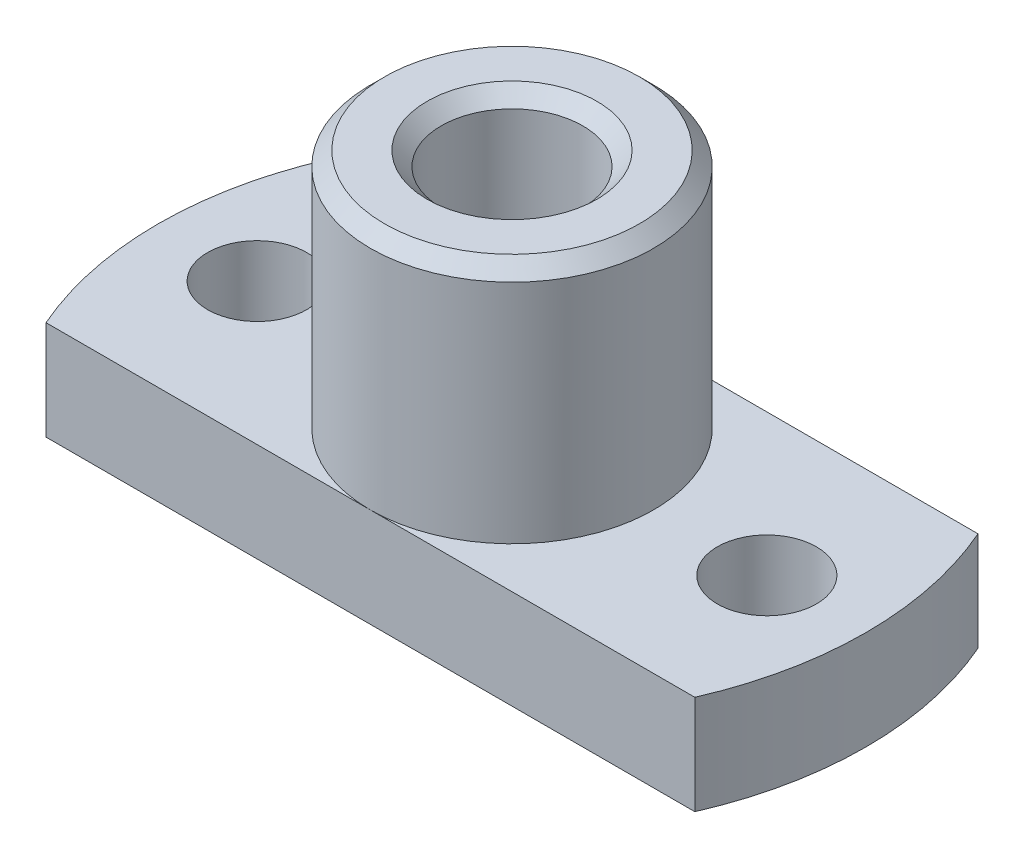
ISO-10303-21;
HEADER;
FILE_DESCRIPTION(('STEP AP214'),'2;1');
FILE_NAME('part.step','',(''),(''),'','','');
FILE_SCHEMA(('AUTOMOTIVE_DESIGN { 1 0 10303 214 1 1 1 1 }'));
ENDSEC;
DATA;
#1=APPLICATION_CONTEXT('core data for automotive mechanical design processes');
#2=APPLICATION_PROTOCOL_DEFINITION('international standard','automotive_design',2000,#1);
#3=PRODUCT_CONTEXT('',#1,'mechanical');
#4=PRODUCT('Part','Part','',(#3));
#5=PRODUCT_RELATED_PRODUCT_CATEGORY('part','',(#4));
#6=PRODUCT_DEFINITION_FORMATION('','',#4);
#7=PRODUCT_DEFINITION_CONTEXT('part definition',#1,'design');
#8=PRODUCT_DEFINITION('design','',#6,#7);
#9=PRODUCT_DEFINITION_SHAPE('','',#8);
#10=(LENGTH_UNIT() NAMED_UNIT(*) SI_UNIT(.MILLI.,.METRE.));
#11=(NAMED_UNIT(*) PLANE_ANGLE_UNIT() SI_UNIT($,.RADIAN.));
#12=(NAMED_UNIT(*) SI_UNIT($,.STERADIAN.) SOLID_ANGLE_UNIT());
#13=UNCERTAINTY_MEASURE_WITH_UNIT(LENGTH_MEASURE(1.E-05),#10,'distance_accuracy_value','');
#14=(GEOMETRIC_REPRESENTATION_CONTEXT(3) GLOBAL_UNCERTAINTY_ASSIGNED_CONTEXT((#13)) GLOBAL_UNIT_ASSIGNED_CONTEXT((#10,
#11,#12)) REPRESENTATION_CONTEXT('',''));
#15=CARTESIAN_POINT('',(0.,0.,0.));
#16=DIRECTION('',(0.,0.,1.));
#17=DIRECTION('',(1.,0.,0.));
#18=AXIS2_PLACEMENT_3D('',#15,#16,#17);
#19=CARTESIAN_POINT('',(0.,3.5,0.));
#20=DIRECTION('',(0.,1.,0.));
#21=DIRECTION('',(0.,0.,1.));
#22=AXIS2_PLACEMENT_3D('',#19,#20,#21);
#23=PLANE('',#22);
#24=CARTESIAN_POINT('',(9.,3.5,0.));
#25=DIRECTION('',(0.,1.,0.));
#26=DIRECTION('',(0.,0.,-1.));
#27=AXIS2_PLACEMENT_3D('',#24,#25,#26);
#28=CIRCLE('',#27,1.75);
#29=CARTESIAN_POINT('',(9.,3.5,-1.75));
#30=VERTEX_POINT('',#29);
#31=EDGE_CURVE('E203',#30,#30,#28,.T.);
#32=ORIENTED_EDGE('',*,*,#31,.F.);
#33=EDGE_LOOP('',(#32));
#34=FACE_BOUND('',#33,.T.);
#35=CARTESIAN_POINT('',(0.,3.5,0.));
#36=DIRECTION('',(0.,1.,0.));
#37=DIRECTION('',(0.,0.,1.));
#38=AXIS2_PLACEMENT_3D('',#35,#36,#37);
#39=CIRCLE('',#38,5.);
#40=CARTESIAN_POINT('',(0.,3.5,5.));
#41=VERTEX_POINT('',#40);
#42=CARTESIAN_POINT('',(0.,3.5,-5.));
#43=VERTEX_POINT('',#42);
#44=EDGE_CURVE('E120',#41,#43,#39,.T.);
#45=ORIENTED_EDGE('',*,*,#44,.F.);
#46=DIRECTION('',(1.,0.,0.));
#47=VECTOR('',#46,1.);
#48=CARTESIAN_POINT('',(0.,3.5,5.));
#49=LINE('',#48,#47);
#50=CARTESIAN_POINT('',(11.4564392373896,3.5,5.));
#51=VERTEX_POINT('',#50);
#52=EDGE_CURVE('E108',#41,#51,#49,.T.);
#53=ORIENTED_EDGE('',*,*,#52,.T.);
#54=CARTESIAN_POINT('',(0.,3.5,0.));
#55=DIRECTION('',(0.,1.,0.));
#56=DIRECTION('',(0.,0.,1.));
#57=AXIS2_PLACEMENT_3D('',#54,#55,#56);
#58=CIRCLE('',#57,12.5);
#59=CARTESIAN_POINT('',(11.4564392373896,3.5,-5.));
#60=VERTEX_POINT('',#59);
#61=EDGE_CURVE('E107',#51,#60,#58,.T.);
#62=ORIENTED_EDGE('',*,*,#61,.T.);
#63=DIRECTION('',(1.,0.,0.));
#64=VECTOR('',#63,1.);
#65=CARTESIAN_POINT('',(0.,3.5,-5.));
#66=LINE('',#65,#64);
#67=EDGE_CURVE('E121',#43,#60,#66,.T.);
#68=ORIENTED_EDGE('',*,*,#67,.F.);
#69=EDGE_LOOP('',(#45,#53,#62,#68));
#70=FACE_BOUND('',#69,.T.);
#71=ADVANCED_FACE('F47',(#34,#70),#23,.T.);
#72=CARTESIAN_POINT('',(0.,3.5,0.));
#73=DIRECTION('',(0.,-1.,0.));
#74=DIRECTION('',(0.,0.,-1.));
#75=AXIS2_PLACEMENT_3D('',#72,#73,#74);
#76=CYLINDRICAL_SURFACE('',#75,12.5);
#77=CARTESIAN_POINT('',(0.,0.,0.));
#78=DIRECTION('',(0.,1.,0.));
#79=DIRECTION('',(0.,0.,1.));
#80=AXIS2_PLACEMENT_3D('',#77,#78,#79);
#81=CIRCLE('',#80,12.5);
#82=CARTESIAN_POINT('',(-11.4564392373896,0.,-5.));
#83=VERTEX_POINT('',#82);
#84=CARTESIAN_POINT('',(-11.4564392373896,0.,5.));
#85=VERTEX_POINT('',#84);
#86=EDGE_CURVE('E124',#83,#85,#81,.T.);
#87=ORIENTED_EDGE('',*,*,#86,.T.);
#88=DIRECTION('',(0.,-1.,0.));
#89=VECTOR('',#88,1.);
#90=CARTESIAN_POINT('',(-11.4564392373896,3.5,5.));
#91=LINE('',#90,#89);
#92=CARTESIAN_POINT('',(-11.4564392373896,3.5,5.));
#93=VERTEX_POINT('',#92);
#94=EDGE_CURVE('E130',#93,#85,#91,.T.);
#95=ORIENTED_EDGE('',*,*,#94,.F.);
#96=CARTESIAN_POINT('',(-11.4564392373896,3.5,-5.));
#97=VERTEX_POINT('',#96);
#98=EDGE_CURVE('E104',#97,#93,#58,.T.);
#99=ORIENTED_EDGE('',*,*,#98,.F.);
#100=DIRECTION('',(0.,-1.,0.));
#101=VECTOR('',#100,1.);
#102=CARTESIAN_POINT('',(-11.4564392373896,3.5,-5.));
#103=LINE('',#102,#101);
#104=EDGE_CURVE('E73',#97,#83,#103,.T.);
#105=ORIENTED_EDGE('',*,*,#104,.T.);
#106=EDGE_LOOP('',(#87,#95,#99,#105));
#107=FACE_BOUND('',#106,.T.);
#108=ADVANCED_FACE('F221',(#107),#76,.T.);
#109=CARTESIAN_POINT('',(0.,3.5,5.));
#110=DIRECTION('',(0.,0.,-1.));
#111=DIRECTION('',(-1.,0.,0.));
#112=AXIS2_PLACEMENT_3D('',#109,#110,#111);
#113=PLANE('',#112);
#114=DIRECTION('',(1.,0.,0.));
#115=VECTOR('',#114,1.);
#116=CARTESIAN_POINT('',(0.,0.,5.));
#117=LINE('',#116,#115);
#118=CARTESIAN_POINT('',(11.4564392373896,0.,5.));
#119=VERTEX_POINT('',#118);
#120=EDGE_CURVE('E148',#85,#119,#117,.T.);
#121=ORIENTED_EDGE('',*,*,#120,.T.);
#122=DIRECTION('',(0.,-1.,0.));
#123=VECTOR('',#122,1.);
#124=CARTESIAN_POINT('',(11.4564392373896,3.5,5.));
#125=LINE('',#124,#123);
#126=EDGE_CURVE('E114',#51,#119,#125,.T.);
#127=ORIENTED_EDGE('',*,*,#126,.F.);
#128=ORIENTED_EDGE('',*,*,#52,.F.);
#129=EDGE_CURVE('E99',#93,#41,#49,.T.);
#130=ORIENTED_EDGE('',*,*,#129,.F.);
#131=ORIENTED_EDGE('',*,*,#94,.T.);
#132=EDGE_LOOP('',(#121,#127,#128,#130,#131));
#133=FACE_BOUND('',#132,.T.);
#134=ADVANCED_FACE('F112',(#133),#113,.F.);
#135=CARTESIAN_POINT('',(11.4564392373896,0.,-5.));
#136=VERTEX_POINT('',#135);
#137=EDGE_CURVE('E149',#119,#136,#81,.T.);
#138=ORIENTED_EDGE('',*,*,#137,.T.);
#139=DIRECTION('',(0.,-1.,0.));
#140=VECTOR('',#139,1.);
#141=CARTESIAN_POINT('',(11.4564392373896,3.5,-5.));
#142=LINE('',#141,#140);
#143=EDGE_CURVE('E157',#60,#136,#142,.T.);
#144=ORIENTED_EDGE('',*,*,#143,.F.);
#145=ORIENTED_EDGE('',*,*,#61,.F.);
#146=ORIENTED_EDGE('',*,*,#126,.T.);
#147=EDGE_LOOP('',(#138,#144,#145,#146));
#148=FACE_BOUND('',#147,.T.);
#149=ADVANCED_FACE('F227',(#148),#76,.T.);
#150=CARTESIAN_POINT('',(0.,3.5,-5.));
#151=DIRECTION('',(0.,0.,-1.));
#152=DIRECTION('',(-1.,0.,0.));
#153=AXIS2_PLACEMENT_3D('',#150,#151,#152);
#154=PLANE('',#153);
#155=DIRECTION('',(1.,0.,0.));
#156=VECTOR('',#155,1.);
#157=CARTESIAN_POINT('',(0.,0.,-5.));
#158=LINE('',#157,#156);
#159=EDGE_CURVE('E141',#83,#136,#158,.T.);
#160=ORIENTED_EDGE('',*,*,#159,.F.);
#161=ORIENTED_EDGE('',*,*,#104,.F.);
#162=EDGE_CURVE('E143',#97,#43,#66,.T.);
#163=ORIENTED_EDGE('',*,*,#162,.T.);
#164=ORIENTED_EDGE('',*,*,#67,.T.);
#165=ORIENTED_EDGE('',*,*,#143,.T.);
#166=EDGE_LOOP('',(#160,#161,#163,#164,#165));
#167=FACE_BOUND('',#166,.T.);
#168=ADVANCED_FACE('F231',(#167),#154,.T.);
#169=CARTESIAN_POINT('',(-9.,3.5,0.));
#170=DIRECTION('',(0.,1.,0.));
#171=DIRECTION('',(0.,0.,1.));
#172=AXIS2_PLACEMENT_3D('',#169,#170,#171);
#173=CIRCLE('',#172,1.75);
#174=CARTESIAN_POINT('',(-9.,3.5,1.75));
#175=VERTEX_POINT('',#174);
#176=EDGE_CURVE('E197',#175,#175,#173,.T.);
#177=ORIENTED_EDGE('',*,*,#176,.F.);
#178=EDGE_LOOP('',(#177));
#179=FACE_BOUND('',#178,.T.);
#180=EDGE_CURVE('E64',#43,#41,#39,.T.);
#181=ORIENTED_EDGE('',*,*,#180,.F.);
#182=ORIENTED_EDGE('',*,*,#162,.F.);
#183=ORIENTED_EDGE('',*,*,#98,.T.);
#184=ORIENTED_EDGE('',*,*,#129,.T.);
#185=EDGE_LOOP('',(#181,#182,#183,#184));
#186=FACE_BOUND('',#185,.T.);
#187=ADVANCED_FACE('F103',(#179,#186),#23,.T.);
#188=CARTESIAN_POINT('',(0.,0.,0.));
#189=DIRECTION('',(0.,1.,0.));
#190=DIRECTION('',(0.,0.,1.));
#191=AXIS2_PLACEMENT_3D('',#188,#189,#190);
#192=PLANE('',#191);
#193=CARTESIAN_POINT('',(-9.,0.,0.));
#194=DIRECTION('',(0.,1.,0.));
#195=DIRECTION('',(0.,0.,1.));
#196=AXIS2_PLACEMENT_3D('',#193,#194,#195);
#197=CIRCLE('',#196,1.75);
#198=CARTESIAN_POINT('',(-9.,0.,1.75));
#199=VERTEX_POINT('',#198);
#200=EDGE_CURVE('E194',#199,#199,#197,.T.);
#201=ORIENTED_EDGE('',*,*,#200,.T.);
#202=EDGE_LOOP('',(#201));
#203=FACE_BOUND('',#202,.T.);
#204=CARTESIAN_POINT('',(9.,0.,0.));
#205=DIRECTION('',(0.,1.,0.));
#206=DIRECTION('',(0.,0.,-1.));
#207=AXIS2_PLACEMENT_3D('',#204,#205,#206);
#208=CIRCLE('',#207,1.75);
#209=CARTESIAN_POINT('',(9.,0.,-1.75));
#210=VERTEX_POINT('',#209);
#211=EDGE_CURVE('E208',#210,#210,#208,.T.);
#212=ORIENTED_EDGE('',*,*,#211,.T.);
#213=EDGE_LOOP('',(#212));
#214=FACE_BOUND('',#213,.T.);
#215=CARTESIAN_POINT('',(0.,0.,0.));
#216=DIRECTION('',(0.,1.,0.));
#217=DIRECTION('',(0.,0.,1.));
#218=AXIS2_PLACEMENT_3D('',#215,#216,#217);
#219=CIRCLE('',#218,2.5);
#220=CARTESIAN_POINT('',(0.,0.,2.5));
#221=VERTEX_POINT('',#220);
#222=EDGE_CURVE('E125',#221,#221,#219,.T.);
#223=ORIENTED_EDGE('',*,*,#222,.T.);
#224=EDGE_LOOP('',(#223));
#225=FACE_BOUND('',#224,.T.);
#226=ORIENTED_EDGE('',*,*,#86,.F.);
#227=ORIENTED_EDGE('',*,*,#159,.T.);
#228=ORIENTED_EDGE('',*,*,#137,.F.);
#229=ORIENTED_EDGE('',*,*,#120,.F.);
#230=EDGE_LOOP('',(#226,#227,#228,#229));
#231=FACE_BOUND('',#230,.T.);
#232=ADVANCED_FACE('F213',(#203,#214,#225,#231),#192,.F.);
#233=CARTESIAN_POINT('',(0.,12.,0.));
#234=DIRECTION('',(0.,-1.,0.));
#235=DIRECTION('',(0.,0.,-1.));
#236=AXIS2_PLACEMENT_3D('',#233,#234,#235);
#237=CYLINDRICAL_SURFACE('',#236,5.);
#238=CARTESIAN_POINT('',(0.,11.5,0.));
#239=DIRECTION('',(0.,1.,0.));
#240=DIRECTION('',(0.,0.,1.));
#241=AXIS2_PLACEMENT_3D('',#238,#239,#240);
#242=CIRCLE('',#241,5.);
#243=CARTESIAN_POINT('',(0.,11.5,5.));
#244=VERTEX_POINT('',#243);
#245=EDGE_CURVE('E57',#244,#244,#242,.F.);
#246=ORIENTED_EDGE('',*,*,#245,.T.);
#247=EDGE_LOOP('',(#246));
#248=FACE_BOUND('',#247,.T.);
#249=ORIENTED_EDGE('',*,*,#44,.T.);
#250=ORIENTED_EDGE('',*,*,#180,.T.);
#251=EDGE_LOOP('',(#249,#250));
#252=FACE_BOUND('',#251,.T.);
#253=ADVANCED_FACE('F127',(#248,#252),#237,.T.);
#254=CARTESIAN_POINT('',(0.,12.,0.));
#255=DIRECTION('',(0.,1.,0.));
#256=DIRECTION('',(0.,0.,1.));
#257=AXIS2_PLACEMENT_3D('',#254,#255,#256);
#258=PLANE('',#257);
#259=CARTESIAN_POINT('',(0.,12.,0.));
#260=DIRECTION('',(0.,1.,0.));
#261=DIRECTION('',(0.,0.,1.));
#262=AXIS2_PLACEMENT_3D('',#259,#260,#261);
#263=CIRCLE('',#262,4.5);
#264=CARTESIAN_POINT('',(0.,12.,4.5));
#265=VERTEX_POINT('',#264);
#266=EDGE_CURVE('E134',#265,#265,#263,.T.);
#267=ORIENTED_EDGE('',*,*,#266,.T.);
#268=EDGE_LOOP('',(#267));
#269=FACE_BOUND('',#268,.T.);
#270=CARTESIAN_POINT('',(0.,12.,0.));
#271=DIRECTION('',(0.,1.,0.));
#272=DIRECTION('',(0.,0.,1.));
#273=AXIS2_PLACEMENT_3D('',#270,#271,#272);
#274=CIRCLE('',#273,3.00000000000001);
#275=CARTESIAN_POINT('',(0.,12.,3.00000000000001));
#276=VERTEX_POINT('',#275);
#277=EDGE_CURVE('E129',#276,#276,#274,.F.);
#278=ORIENTED_EDGE('',*,*,#277,.T.);
#279=EDGE_LOOP('',(#278));
#280=FACE_BOUND('',#279,.T.);
#281=ADVANCED_FACE('F175',(#269,#280),#258,.T.);
#282=CARTESIAN_POINT('',(0.,0.,0.));
#283=DIRECTION('',(0.,1.,0.));
#284=DIRECTION('',(0.,0.,1.));
#285=AXIS2_PLACEMENT_3D('',#282,#283,#284);
#286=CYLINDRICAL_SURFACE('',#285,2.5);
#287=CARTESIAN_POINT('',(0.,11.5,0.));
#288=DIRECTION('',(0.,1.,0.));
#289=DIRECTION('',(0.,0.,1.));
#290=AXIS2_PLACEMENT_3D('',#287,#288,#289);
#291=CIRCLE('',#290,2.5);
#292=CARTESIAN_POINT('',(0.,11.5,2.5));
#293=VERTEX_POINT('',#292);
#294=EDGE_CURVE('E11',#293,#293,#291,.T.);
#295=ORIENTED_EDGE('',*,*,#294,.T.);
#296=EDGE_LOOP('',(#295));
#297=FACE_BOUND('',#296,.T.);
#298=ORIENTED_EDGE('',*,*,#222,.F.);
#299=EDGE_LOOP('',(#298));
#300=FACE_BOUND('',#299,.T.);
#301=ADVANCED_FACE('F178',(#297,#300),#286,.F.);
#302=CARTESIAN_POINT('',(9.,0.,0.));
#303=DIRECTION('',(0.,1.,0.));
#304=DIRECTION('',(0.,0.,1.));
#305=AXIS2_PLACEMENT_3D('',#302,#303,#304);
#306=CYLINDRICAL_SURFACE('',#305,1.75);
#307=ORIENTED_EDGE('',*,*,#211,.F.);
#308=EDGE_LOOP('',(#307));
#309=FACE_BOUND('',#308,.T.);
#310=ORIENTED_EDGE('',*,*,#31,.T.);
#311=EDGE_LOOP('',(#310));
#312=FACE_BOUND('',#311,.T.);
#313=ADVANCED_FACE('F188',(#309,#312),#306,.F.);
#314=CARTESIAN_POINT('',(-9.,0.,0.));
#315=DIRECTION('',(0.,1.,0.));
#316=DIRECTION('',(0.,0.,1.));
#317=AXIS2_PLACEMENT_3D('',#314,#315,#316);
#318=CYLINDRICAL_SURFACE('',#317,1.75);
#319=ORIENTED_EDGE('',*,*,#200,.F.);
#320=EDGE_LOOP('',(#319));
#321=FACE_BOUND('',#320,.T.);
#322=ORIENTED_EDGE('',*,*,#176,.T.);
#323=EDGE_LOOP('',(#322));
#324=FACE_BOUND('',#323,.T.);
#325=ADVANCED_FACE('F172',(#321,#324),#318,.F.);
#326=CARTESIAN_POINT('',(0.,12.,0.));
#327=DIRECTION('',(0.,-1.,0.));
#328=DIRECTION('',(0.,0.,-1.));
#329=AXIS2_PLACEMENT_3D('',#326,#327,#328);
#330=CONICAL_SURFACE('',#329,4.5,0.785398163397444);
#331=ORIENTED_EDGE('',*,*,#245,.F.);
#332=EDGE_LOOP('',(#331));
#333=FACE_BOUND('',#332,.T.);
#334=ORIENTED_EDGE('',*,*,#266,.F.);
#335=EDGE_LOOP('',(#334));
#336=FACE_BOUND('',#335,.T.);
#337=ADVANCED_FACE('F169',(#333,#336),#330,.T.);
#338=CARTESIAN_POINT('',(0.,11.5,0.));
#339=DIRECTION('',(0.,1.,0.));
#340=DIRECTION('',(0.,0.,1.));
#341=AXIS2_PLACEMENT_3D('',#338,#339,#340);
#342=CONICAL_SURFACE('',#341,2.5,0.78539816339745);
#343=ORIENTED_EDGE('',*,*,#277,.F.);
#344=EDGE_LOOP('',(#343));
#345=FACE_BOUND('',#344,.T.);
#346=ORIENTED_EDGE('',*,*,#294,.F.);
#347=EDGE_LOOP('',(#346));
#348=FACE_BOUND('',#347,.T.);
#349=ADVANCED_FACE('F50',(#345,#348),#342,.F.);
#350=CLOSED_SHELL('',(#71,#108,#134,#149,#168,#187,#232,#253,#281,#301,#313,#325,#337,#349));
#351=MANIFOLD_SOLID_BREP('B2',#350);
#352=ADVANCED_BREP_SHAPE_REPRESENTATION('',(#18,#351),#14);
#353=SHAPE_DEFINITION_REPRESENTATION(#9,#352);
ENDSEC;
END-ISO-10303-21;
